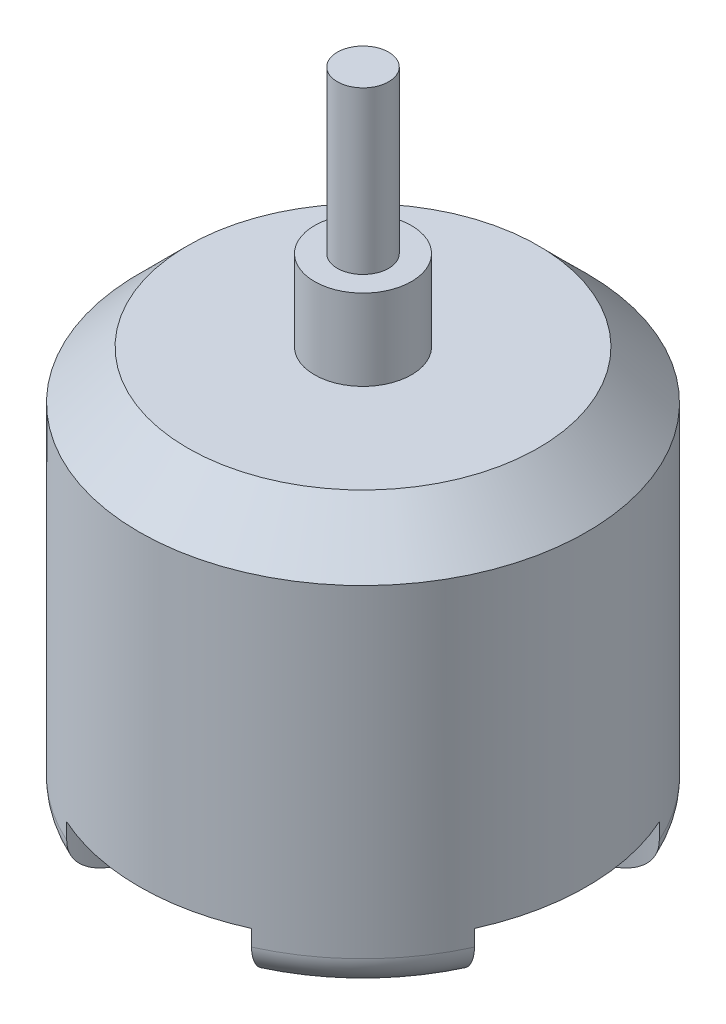
ISO-10303-21;
HEADER;
FILE_DESCRIPTION(('STEP AP214'),'2;1');
FILE_NAME('part.step','',(''),(''),'','','');
FILE_SCHEMA(('AUTOMOTIVE_DESIGN { 1 0 10303 214 1 1 1 1 }'));
ENDSEC;
DATA;
#1=APPLICATION_CONTEXT('core data for automotive mechanical design processes');
#2=APPLICATION_PROTOCOL_DEFINITION('international standard','automotive_design',2000,#1);
#3=PRODUCT_CONTEXT('',#1,'mechanical');
#4=PRODUCT('Part','Part','',(#3));
#5=PRODUCT_RELATED_PRODUCT_CATEGORY('part','',(#4));
#6=PRODUCT_DEFINITION_FORMATION('','',#4);
#7=PRODUCT_DEFINITION_CONTEXT('part definition',#1,'design');
#8=PRODUCT_DEFINITION('design','',#6,#7);
#9=PRODUCT_DEFINITION_SHAPE('','',#8);
#10=(LENGTH_UNIT() NAMED_UNIT(*) SI_UNIT(.MILLI.,.METRE.));
#11=(NAMED_UNIT(*) PLANE_ANGLE_UNIT() SI_UNIT($,.RADIAN.));
#12=(NAMED_UNIT(*) SI_UNIT($,.STERADIAN.) SOLID_ANGLE_UNIT());
#13=UNCERTAINTY_MEASURE_WITH_UNIT(LENGTH_MEASURE(1.E-05),#10,'distance_accuracy_value','');
#14=(GEOMETRIC_REPRESENTATION_CONTEXT(3) GLOBAL_UNCERTAINTY_ASSIGNED_CONTEXT((#13)) GLOBAL_UNIT_ASSIGNED_CONTEXT((#10,
#11,#12)) REPRESENTATION_CONTEXT('',''));
#15=CARTESIAN_POINT('',(0.,0.,0.));
#16=DIRECTION('',(0.,0.,1.));
#17=DIRECTION('',(1.,0.,0.));
#18=AXIS2_PLACEMENT_3D('',#15,#16,#17);
#19=CARTESIAN_POINT('',(0.,0.,0.));
#20=DIRECTION('',(0.,1.,0.));
#21=DIRECTION('',(0.,0.,1.));
#22=AXIS2_PLACEMENT_3D('',#19,#20,#21);
#23=PLANE('',#22);
#24=CARTESIAN_POINT('',(0.,0.,0.));
#25=DIRECTION('',(0.,1.,0.));
#26=DIRECTION('',(0.,0.,1.));
#27=AXIS2_PLACEMENT_3D('',#24,#25,#26);
#28=CIRCLE('',#27,13.85);
#29=CARTESIAN_POINT('',(-12.6145306859203,0.,-5.71805172886495));
#30=VERTEX_POINT('',#29);
#31=CARTESIAN_POINT('',(-12.6145306859206,0.,5.71805172886424));
#32=VERTEX_POINT('',#31);
#33=EDGE_CURVE('E274',#30,#32,#28,.T.);
#34=ORIENTED_EDGE('',*,*,#33,.F.);
#35=CARTESIAN_POINT('',(-13.8499999999996,0.,-3.92792607702686E-13));
#36=DIRECTION('',(0.,-1.,0.));
#37=DIRECTION('',(0.,0.,-1.));
#38=AXIS2_PLACEMENT_3D('',#35,#36,#37);
#39=CIRCLE('',#38,5.85000000000023);
#40=EDGE_CURVE('E191',#30,#32,#39,.T.);
#41=ORIENTED_EDGE('',*,*,#40,.T.);
#42=EDGE_LOOP('',(#34,#41));
#43=FACE_BOUND('',#42,.T.);
#44=ADVANCED_FACE('F43',(#43),#23,.F.);
#45=CARTESIAN_POINT('',(-5.71805172886431,0.,12.6145306859206));
#46=VERTEX_POINT('',#45);
#47=CARTESIAN_POINT('',(5.71805172886431,0.,12.6145306859206));
#48=VERTEX_POINT('',#47);
#49=EDGE_CURVE('E270',#46,#48,#28,.T.);
#50=ORIENTED_EDGE('',*,*,#49,.F.);
#51=CARTESIAN_POINT('',(0.,0.,13.85));
#52=DIRECTION('',(0.,-1.,0.));
#53=DIRECTION('',(0.,0.,-1.));
#54=AXIS2_PLACEMENT_3D('',#51,#52,#53);
#55=CIRCLE('',#54,5.85);
#56=EDGE_CURVE('E196',#46,#48,#55,.T.);
#57=ORIENTED_EDGE('',*,*,#56,.T.);
#58=EDGE_LOOP('',(#50,#57));
#59=FACE_BOUND('',#58,.T.);
#60=ADVANCED_FACE('F391',(#59),#23,.F.);
#61=CARTESIAN_POINT('',(12.6145306859206,0.,5.71805172886426));
#62=VERTEX_POINT('',#61);
#63=CARTESIAN_POINT('',(12.6145306859206,0.,-5.71805172886435));
#64=VERTEX_POINT('',#63);
#65=EDGE_CURVE('E275',#62,#64,#28,.T.);
#66=ORIENTED_EDGE('',*,*,#65,.F.);
#67=CARTESIAN_POINT('',(13.85,0.,0.));
#68=DIRECTION('',(0.,-1.,0.));
#69=DIRECTION('',(0.,0.,-1.));
#70=AXIS2_PLACEMENT_3D('',#67,#68,#69);
#71=CIRCLE('',#70,5.85);
#72=EDGE_CURVE('E216',#62,#64,#71,.T.);
#73=ORIENTED_EDGE('',*,*,#72,.T.);
#74=EDGE_LOOP('',(#66,#73));
#75=FACE_BOUND('',#74,.T.);
#76=ADVANCED_FACE('F397',(#75),#23,.F.);
#77=CARTESIAN_POINT('',(5.71805172886432,0.,-12.6145306859206));
#78=VERTEX_POINT('',#77);
#79=CARTESIAN_POINT('',(-5.71805172886432,0.,-12.6145306859206));
#80=VERTEX_POINT('',#79);
#81=EDGE_CURVE('E413',#78,#80,#28,.T.);
#82=ORIENTED_EDGE('',*,*,#81,.F.);
#83=CARTESIAN_POINT('',(0.,0.,-13.85));
#84=DIRECTION('',(0.,-1.,0.));
#85=DIRECTION('',(0.,0.,-1.));
#86=AXIS2_PLACEMENT_3D('',#83,#84,#85);
#87=CIRCLE('',#86,5.85000000000001);
#88=EDGE_CURVE('E212',#78,#80,#87,.T.);
#89=ORIENTED_EDGE('',*,*,#88,.T.);
#90=EDGE_LOOP('',(#82,#89));
#91=FACE_BOUND('',#90,.T.);
#92=ADVANCED_FACE('F393',(#91),#23,.F.);
#93=CARTESIAN_POINT('',(0.,0.,0.));
#94=DIRECTION('',(0.,1.,0.));
#95=DIRECTION('',(0.,0.,1.));
#96=AXIS2_PLACEMENT_3D('',#93,#94,#95);
#97=CYLINDRICAL_SURFACE('',#96,13.85);
#98=CARTESIAN_POINT('',(0.,19.,0.));
#99=DIRECTION('',(0.,1.,0.));
#100=DIRECTION('',(0.,0.,1.));
#101=AXIS2_PLACEMENT_3D('',#98,#99,#100);
#102=CIRCLE('',#101,13.85);
#103=CARTESIAN_POINT('',(0.,19.,13.85));
#104=VERTEX_POINT('',#103);
#105=EDGE_CURVE('E266',#104,#104,#102,.T.);
#106=ORIENTED_EDGE('',*,*,#105,.F.);
#107=EDGE_LOOP('',(#106));
#108=FACE_BOUND('',#107,.T.);
#109=DIRECTION('',(0.,1.,0.));
#110=VECTOR('',#109,1.);
#111=CARTESIAN_POINT('',(-5.71805172886432,-3.,-12.6145306859206));
#112=LINE('',#111,#110);
#113=CARTESIAN_POINT('',(-5.71805172886432,-1.,-12.6145306859206));
#114=VERTEX_POINT('',#113);
#115=EDGE_CURVE('E240',#114,#80,#112,.T.);
#116=ORIENTED_EDGE('',*,*,#115,.F.);
#117=CARTESIAN_POINT('',(0.,-1.,0.));
#118=DIRECTION('',(0.,-1.,0.));
#119=DIRECTION('',(0.,0.,-1.));
#120=AXIS2_PLACEMENT_3D('',#117,#118,#119);
#121=CIRCLE('',#120,13.85);
#122=CARTESIAN_POINT('',(-12.6145306859203,-1.,-5.71805172886495));
#123=VERTEX_POINT('',#122);
#124=EDGE_CURVE('E430',#114,#123,#121,.F.);
#125=ORIENTED_EDGE('',*,*,#124,.T.);
#126=DIRECTION('',(0.,1.,0.));
#127=VECTOR('',#126,1.);
#128=CARTESIAN_POINT('',(-12.6145306859203,-3.,-5.71805172886495));
#129=LINE('',#128,#127);
#130=EDGE_CURVE('E243',#123,#30,#129,.T.);
#131=ORIENTED_EDGE('',*,*,#130,.T.);
#132=ORIENTED_EDGE('',*,*,#33,.T.);
#133=DIRECTION('',(0.,1.,0.));
#134=VECTOR('',#133,1.);
#135=CARTESIAN_POINT('',(-12.6145306859206,-3.,5.71805172886424));
#136=LINE('',#135,#134);
#137=CARTESIAN_POINT('',(-12.6145306859206,-1.,5.71805172886424));
#138=VERTEX_POINT('',#137);
#139=EDGE_CURVE('E208',#138,#32,#136,.T.);
#140=ORIENTED_EDGE('',*,*,#139,.F.);
#141=CARTESIAN_POINT('',(0.,-1.,0.));
#142=DIRECTION('',(0.,-1.,0.));
#143=DIRECTION('',(0.,0.,-1.));
#144=AXIS2_PLACEMENT_3D('',#141,#142,#143);
#145=CIRCLE('',#144,13.85);
#146=CARTESIAN_POINT('',(-5.71805172886431,-1.,12.6145306859206));
#147=VERTEX_POINT('',#146);
#148=EDGE_CURVE('E65',#138,#147,#145,.F.);
#149=ORIENTED_EDGE('',*,*,#148,.T.);
#150=DIRECTION('',(0.,1.,0.));
#151=VECTOR('',#150,1.);
#152=CARTESIAN_POINT('',(-5.71805172886431,-3.,12.6145306859206));
#153=LINE('',#152,#151);
#154=EDGE_CURVE('E225',#147,#46,#153,.T.);
#155=ORIENTED_EDGE('',*,*,#154,.T.);
#156=ORIENTED_EDGE('',*,*,#49,.T.);
#157=DIRECTION('',(0.,1.,0.));
#158=VECTOR('',#157,1.);
#159=CARTESIAN_POINT('',(5.71805172886431,-3.,12.6145306859206));
#160=LINE('',#159,#158);
#161=CARTESIAN_POINT('',(5.71805172886431,-1.,12.6145306859206));
#162=VERTEX_POINT('',#161);
#163=EDGE_CURVE('E228',#162,#48,#160,.T.);
#164=ORIENTED_EDGE('',*,*,#163,.F.);
#165=CARTESIAN_POINT('',(0.,-1.,0.));
#166=DIRECTION('',(0.,-1.,0.));
#167=DIRECTION('',(0.,0.,-1.));
#168=AXIS2_PLACEMENT_3D('',#165,#166,#167);
#169=CIRCLE('',#168,13.85);
#170=CARTESIAN_POINT('',(12.6145306859206,-1.,5.71805172886426));
#171=VERTEX_POINT('',#170);
#172=EDGE_CURVE('E689',#162,#171,#169,.F.);
#173=ORIENTED_EDGE('',*,*,#172,.T.);
#174=DIRECTION('',(0.,1.,0.));
#175=VECTOR('',#174,1.);
#176=CARTESIAN_POINT('',(12.6145306859206,-3.,5.71805172886426));
#177=LINE('',#176,#175);
#178=EDGE_CURVE('E231',#171,#62,#177,.T.);
#179=ORIENTED_EDGE('',*,*,#178,.T.);
#180=ORIENTED_EDGE('',*,*,#65,.T.);
#181=DIRECTION('',(0.,1.,0.));
#182=VECTOR('',#181,1.);
#183=CARTESIAN_POINT('',(12.6145306859206,-3.,-5.71805172886435));
#184=LINE('',#183,#182);
#185=CARTESIAN_POINT('',(12.6145306859206,-1.,-5.71805172886435));
#186=VERTEX_POINT('',#185);
#187=EDGE_CURVE('E234',#186,#64,#184,.T.);
#188=ORIENTED_EDGE('',*,*,#187,.F.);
#189=CARTESIAN_POINT('',(0.,-1.,0.));
#190=DIRECTION('',(0.,-1.,0.));
#191=DIRECTION('',(0.,0.,-1.));
#192=AXIS2_PLACEMENT_3D('',#189,#190,#191);
#193=CIRCLE('',#192,13.85);
#194=CARTESIAN_POINT('',(5.71805172886432,-1.,-12.6145306859206));
#195=VERTEX_POINT('',#194);
#196=EDGE_CURVE('E695',#186,#195,#193,.F.);
#197=ORIENTED_EDGE('',*,*,#196,.T.);
#198=DIRECTION('',(0.,1.,0.));
#199=VECTOR('',#198,1.);
#200=CARTESIAN_POINT('',(5.71805172886432,-3.,-12.6145306859206));
#201=LINE('',#200,#199);
#202=EDGE_CURVE('E237',#195,#78,#201,.T.);
#203=ORIENTED_EDGE('',*,*,#202,.T.);
#204=ORIENTED_EDGE('',*,*,#81,.T.);
#205=EDGE_LOOP('',(#116,#125,#131,#132,#140,#149,#155,#156,#164,#173,#179,#180,#188,#197,#203,#204));
#206=FACE_BOUND('',#205,.T.);
#207=ADVANCED_FACE('F402',(#108,#206),#97,.T.);
#208=CARTESIAN_POINT('',(0.,19.,0.));
#209=DIRECTION('',(0.,-1.,0.));
#210=DIRECTION('',(0.,0.,-1.));
#211=AXIS2_PLACEMENT_3D('',#208,#209,#210);
#212=CONICAL_SURFACE('',#211,13.85,0.785398163397448);
#213=CARTESIAN_POINT('',(0.,22.,0.));
#214=DIRECTION('',(0.,1.,0.));
#215=DIRECTION('',(0.,0.,1.));
#216=AXIS2_PLACEMENT_3D('',#213,#214,#215);
#217=CIRCLE('',#216,10.85);
#218=CARTESIAN_POINT('',(0.,22.,10.85));
#219=VERTEX_POINT('',#218);
#220=EDGE_CURVE('E262',#219,#219,#217,.T.);
#221=ORIENTED_EDGE('',*,*,#220,.F.);
#222=EDGE_LOOP('',(#221));
#223=FACE_BOUND('',#222,.T.);
#224=ORIENTED_EDGE('',*,*,#105,.T.);
#225=EDGE_LOOP('',(#224));
#226=FACE_BOUND('',#225,.T.);
#227=ADVANCED_FACE('F408',(#223,#226),#212,.T.);
#228=CARTESIAN_POINT('',(3.,22.,0.));
#229=DIRECTION('',(0.,-1.,0.));
#230=DIRECTION('',(0.,0.,-1.));
#231=AXIS2_PLACEMENT_3D('',#228,#229,#230);
#232=PLANE('',#231);
#233=CARTESIAN_POINT('',(0.,22.,0.));
#234=DIRECTION('',(0.,1.,0.));
#235=DIRECTION('',(0.,0.,1.));
#236=AXIS2_PLACEMENT_3D('',#233,#234,#235);
#237=CIRCLE('',#236,3.);
#238=CARTESIAN_POINT('',(0.,22.,3.));
#239=VERTEX_POINT('',#238);
#240=EDGE_CURVE('E258',#239,#239,#237,.T.);
#241=ORIENTED_EDGE('',*,*,#240,.F.);
#242=EDGE_LOOP('',(#241));
#243=FACE_BOUND('',#242,.T.);
#244=ORIENTED_EDGE('',*,*,#220,.T.);
#245=EDGE_LOOP('',(#244));
#246=FACE_BOUND('',#245,.T.);
#247=ADVANCED_FACE('F463',(#243,#246),#232,.F.);
#248=CARTESIAN_POINT('',(0.,0.,0.));
#249=DIRECTION('',(0.,1.,0.));
#250=DIRECTION('',(0.,0.,1.));
#251=AXIS2_PLACEMENT_3D('',#248,#249,#250);
#252=CYLINDRICAL_SURFACE('',#251,3.);
#253=CARTESIAN_POINT('',(0.,27.,0.));
#254=DIRECTION('',(0.,1.,0.));
#255=DIRECTION('',(0.,0.,1.));
#256=AXIS2_PLACEMENT_3D('',#253,#254,#255);
#257=CIRCLE('',#256,3.);
#258=CARTESIAN_POINT('',(0.,27.,3.));
#259=VERTEX_POINT('',#258);
#260=EDGE_CURVE('E254',#259,#259,#257,.T.);
#261=ORIENTED_EDGE('',*,*,#260,.F.);
#262=EDGE_LOOP('',(#261));
#263=FACE_BOUND('',#262,.T.);
#264=ORIENTED_EDGE('',*,*,#240,.T.);
#265=EDGE_LOOP('',(#264));
#266=FACE_BOUND('',#265,.T.);
#267=ADVANCED_FACE('F459',(#263,#266),#252,.T.);
#268=CARTESIAN_POINT('',(3.,27.,0.));
#269=DIRECTION('',(0.,-1.,0.));
#270=DIRECTION('',(0.,0.,-1.));
#271=AXIS2_PLACEMENT_3D('',#268,#269,#270);
#272=PLANE('',#271);
#273=CARTESIAN_POINT('',(0.,27.,0.));
#274=DIRECTION('',(0.,1.,0.));
#275=DIRECTION('',(0.,0.,1.));
#276=AXIS2_PLACEMENT_3D('',#273,#274,#275);
#277=CIRCLE('',#276,1.58750000000001);
#278=CARTESIAN_POINT('',(0.,27.,1.58750000000001));
#279=VERTEX_POINT('',#278);
#280=EDGE_CURVE('E250',#279,#279,#277,.T.);
#281=ORIENTED_EDGE('',*,*,#280,.F.);
#282=EDGE_LOOP('',(#281));
#283=FACE_BOUND('',#282,.T.);
#284=ORIENTED_EDGE('',*,*,#260,.T.);
#285=EDGE_LOOP('',(#284));
#286=FACE_BOUND('',#285,.T.);
#287=ADVANCED_FACE('F455',(#283,#286),#272,.F.);
#288=CARTESIAN_POINT('',(0.,0.,0.));
#289=DIRECTION('',(0.,1.,0.));
#290=DIRECTION('',(0.,0.,1.));
#291=AXIS2_PLACEMENT_3D('',#288,#289,#290);
#292=CYLINDRICAL_SURFACE('',#291,1.5875);
#293=CARTESIAN_POINT('',(0.,37.,0.));
#294=DIRECTION('',(0.,1.,0.));
#295=DIRECTION('',(0.,0.,1.));
#296=AXIS2_PLACEMENT_3D('',#293,#294,#295);
#297=CIRCLE('',#296,1.5875);
#298=CARTESIAN_POINT('',(0.,37.,1.5875));
#299=VERTEX_POINT('',#298);
#300=EDGE_CURVE('E246',#299,#299,#297,.T.);
#301=ORIENTED_EDGE('',*,*,#300,.F.);
#302=EDGE_LOOP('',(#301));
#303=FACE_BOUND('',#302,.T.);
#304=ORIENTED_EDGE('',*,*,#280,.T.);
#305=EDGE_LOOP('',(#304));
#306=FACE_BOUND('',#305,.T.);
#307=ADVANCED_FACE('F451',(#303,#306),#292,.T.);
#308=CARTESIAN_POINT('',(1.5875,37.,0.));
#309=DIRECTION('',(0.,-1.,0.));
#310=DIRECTION('',(0.,0.,-1.));
#311=AXIS2_PLACEMENT_3D('',#308,#309,#310);
#312=PLANE('',#311);
#313=ORIENTED_EDGE('',*,*,#300,.T.);
#314=EDGE_LOOP('',(#313));
#315=FACE_BOUND('',#314,.T.);
#316=ADVANCED_FACE('F447',(#315),#312,.F.);
#317=CARTESIAN_POINT('',(-13.8499999999996,-3.,-3.92792607702686E-13));
#318=DIRECTION('',(0.,1.,0.));
#319=DIRECTION('',(0.,0.,1.));
#320=AXIS2_PLACEMENT_3D('',#317,#318,#319);
#321=CYLINDRICAL_SURFACE('',#320,5.85000000000023);
#322=ORIENTED_EDGE('',*,*,#130,.F.);
#323=CARTESIAN_POINT('',(-12.6145306859203,-1.,-5.71805172886495));
#324=CARTESIAN_POINT('',(-12.6145330000705,-1.05570081538762,-5.7180473894927));
#325=CARTESIAN_POINT('',(-12.6122020833294,-1.11137417006443,-5.71754911660652));
#326=CARTESIAN_POINT('',(-12.6029205618121,-1.22230756060143,-5.71553378080432));
#327=CARTESIAN_POINT('',(-12.5959706522789,-1.27756765739883,-5.71401687121143));
#328=CARTESIAN_POINT('',(-12.568310656893,-1.44192381325606,-5.70790246282174));
#329=CARTESIAN_POINT('',(-12.5407897579977,-1.54989578133468,-5.70174157621582));
#330=CARTESIAN_POINT('',(-12.4687472938042,-1.75954401260011,-5.68471569210493));
#331=CARTESIAN_POINT('',(-12.4242252171472,-1.86122008631306,-5.67385055310487));
#332=CARTESIAN_POINT('',(-12.3199343465871,-2.05566221921237,-5.64661795797403));
#333=CARTESIAN_POINT('',(-12.2601615774402,-2.14842594661591,-5.63024906688169));
#334=CARTESIAN_POINT('',(-12.126616817756,-2.32383660233649,-5.59082767388081));
#335=CARTESIAN_POINT('',(-12.0526561796309,-2.40631918240938,-5.56768259882573));
#336=CARTESIAN_POINT('',(-11.8939591577988,-2.55732989754863,-5.51392845667296));
#337=CARTESIAN_POINT('',(-11.8092227444341,-2.62585799420715,-5.48331936903208));
#338=CARTESIAN_POINT('',(-11.6322761712508,-2.7467464233644,-5.41416514264556));
#339=CARTESIAN_POINT('',(-11.5400922921115,-2.79916072023097,-5.37564722940965));
#340=CARTESIAN_POINT('',(-11.3512947749081,-2.88648116737863,-5.29052554737378));
#341=CARTESIAN_POINT('',(-11.2546843478148,-2.92139979606661,-5.24392757352402));
#342=CARTESIAN_POINT('',(-11.0908982633223,-2.96468414313223,-5.15902268272932));
#343=CARTESIAN_POINT('',(-11.0239551129778,-2.97793705152456,-5.12267287630856));
#344=CARTESIAN_POINT('',(-10.8907179187829,-2.99560323410721,-5.0468891484772));
#345=CARTESIAN_POINT('',(-10.8244234259063,-3.00002312818985,-5.00745755975316));
#346=CARTESIAN_POINT('',(-10.7589350180502,-3.,-4.96667064313437));
#347=B_SPLINE_CURVE_WITH_KNOTS('',3,(#323,#324,#325,#326,#327,#328,#329,#330,#331,#332,#333,
#334,#335,#336,#337,#338,#339,#340,#341,#342,#343,#344,#345,#346),.UNSPECIFIED.,.F.,.F.,(4,2,2,
2,2,2,2,2,2,2,2,4),(0.,0.166997380618441,0.333969630764376,0.667025697489288,1.00009178261168,
1.33324477355887,1.67118033576754,2.00911682808606,2.34590893848005,2.68246049602667,
2.91388037425278,3.14512674998118),.UNSPECIFIED.);
#348=CARTESIAN_POINT('',(-10.7589350180502,-3.,-4.96667064313437));
#349=VERTEX_POINT('',#348);
#350=EDGE_CURVE('E425',#123,#349,#347,.T.);
#351=ORIENTED_EDGE('',*,*,#350,.T.);
#352=CARTESIAN_POINT('',(-13.8499999999996,-3.,-3.92792607702686E-13));
#353=DIRECTION('',(0.,-1.,0.));
#354=DIRECTION('',(0.,0.,-1.));
#355=AXIS2_PLACEMENT_3D('',#352,#353,#354);
#356=CIRCLE('',#355,5.85000000000023);
#357=CARTESIAN_POINT('',(-10.7589350180505,-3.,4.96667064313376));
#358=VERTEX_POINT('',#357);
#359=EDGE_CURVE('E192',#349,#358,#356,.T.);
#360=ORIENTED_EDGE('',*,*,#359,.T.);
#361=CARTESIAN_POINT('',(-10.7589350180505,-3.,4.96667064313376));
#362=CARTESIAN_POINT('',(-10.804671377281,-3.00000722963411,4.99514322804048));
#363=CARTESIAN_POINT('',(-10.8508078080222,-2.99785662049402,5.02297231958333));
#364=CARTESIAN_POINT('',(-10.9435240861829,-2.98924656263651,5.07718036376893));
#365=CARTESIAN_POINT('',(-10.9901039042362,-2.98278739734946,5.10355941167656));
#366=CARTESIAN_POINT('',(-11.0832588392214,-2.96558506931647,5.15465452546555));
#367=CARTESIAN_POINT('',(-11.1298337622994,-2.95485089319194,5.17937395350071));
#368=CARTESIAN_POINT('',(-11.2226867152273,-2.92917097447299,5.22708859419441));
#369=CARTESIAN_POINT('',(-11.2689647516205,-2.91422532502858,5.25008384497433));
#370=CARTESIAN_POINT('',(-11.406832186466,-2.86318416830183,5.31636955143398));
#371=CARTESIAN_POINT('',(-11.4975002067876,-2.82087607758544,5.35698459878516));
#372=CARTESIAN_POINT('',(-11.673190662872,-2.72095543155455,5.4307565371459));
#373=CARTESIAN_POINT('',(-11.7582120307293,-2.66333999152948,5.46391202020346));
#374=CARTESIAN_POINT('',(-11.9210851915156,-2.53345115875329,5.52353312265023));
#375=CARTESIAN_POINT('',(-11.9988157373216,-2.46097813179598,5.54989523470648));
#376=CARTESIAN_POINT('',(-12.1431209412807,-2.30381384627048,5.5959643295655));
#377=CARTESIAN_POINT('',(-12.2096921616512,-2.21911883745185,5.61566926342497));
#378=CARTESIAN_POINT('',(-12.3313584015067,-2.03669846952929,5.64981090759676));
#379=CARTESIAN_POINT('',(-12.3860028606903,-1.9386356468541,5.66405257707542));
#380=CARTESIAN_POINT('',(-12.4787819352776,-1.73443314868439,5.68722729520342));
#381=CARTESIAN_POINT('',(-12.5169252042533,-1.62829774104613,5.69616312726397));
#382=CARTESIAN_POINT('',(-12.5686505890412,-1.43509123043783,5.70799478163376));
#383=CARTESIAN_POINT('',(-12.5858040685336,-1.34901363467935,5.71179072312809));
#384=CARTESIAN_POINT('',(-12.6087660618301,-1.17530572163119,5.71680591919321));
#385=CARTESIAN_POINT('',(-12.6145769475427,-1.08767573283887,5.71802571248007));
#386=CARTESIAN_POINT('',(-12.6145306859206,-1.,5.71805172886424));
#387=B_SPLINE_CURVE_WITH_KNOTS('',3,(#361,#362,#363,#364,#365,#366,#367,#368,#369,#370,#371,
#372,#373,#374,#375,#376,#377,#378,#379,#380,#381,#382,#383,#384,#385,#386),.UNSPECIFIED.,.F.,
.F.,(4,2,2,2,2,2,2,2,2,2,2,2,4),(0.,0.161574918589478,0.323139209320767,0.484365648828899,
0.64558852258622,0.96787955107993,1.2902313593075,1.61723760444341,1.94434440391874,
2.2822323198456,2.61994282479052,2.88274174984926,3.14548571377336),.UNSPECIFIED.);
#388=EDGE_CURVE('E73',#358,#138,#387,.T.);
#389=ORIENTED_EDGE('',*,*,#388,.T.);
#390=ORIENTED_EDGE('',*,*,#139,.T.);
#391=ORIENTED_EDGE('',*,*,#40,.F.);
#392=EDGE_LOOP('',(#322,#351,#360,#389,#390,#391));
#393=FACE_BOUND('',#392,.T.);
#394=ADVANCED_FACE('F423',(#393),#321,.F.);
#395=CARTESIAN_POINT('',(0.,-3.,-13.85));
#396=DIRECTION('',(0.,1.,0.));
#397=DIRECTION('',(0.,0.,1.));
#398=AXIS2_PLACEMENT_3D('',#395,#396,#397);
#399=CYLINDRICAL_SURFACE('',#398,5.85000000000001);
#400=CARTESIAN_POINT('',(0.,-3.,-13.85));
#401=DIRECTION('',(0.,-1.,0.));
#402=DIRECTION('',(0.,0.,-1.));
#403=AXIS2_PLACEMENT_3D('',#400,#401,#402);
#404=CIRCLE('',#403,5.85000000000001);
#405=CARTESIAN_POINT('',(4.96667064313367,-3.,-10.7589350180505));
#406=VERTEX_POINT('',#405);
#407=CARTESIAN_POINT('',(-4.96667064313367,-3.,-10.7589350180505));
#408=VERTEX_POINT('',#407);
#409=EDGE_CURVE('E195',#406,#408,#404,.T.);
#410=ORIENTED_EDGE('',*,*,#409,.T.);
#411=CARTESIAN_POINT('',(-4.96667064313367,-3.,-10.7589350180505));
#412=CARTESIAN_POINT('',(-4.9951432280404,-3.00000722963411,-10.804671377281));
#413=CARTESIAN_POINT('',(-5.02297231958326,-2.99785662049402,-10.8508078080223));
#414=CARTESIAN_POINT('',(-5.07718036376886,-2.98924656263651,-10.9435240861829));
#415=CARTESIAN_POINT('',(-5.1035594116765,-2.98278739734946,-10.9901039042362));
#416=CARTESIAN_POINT('',(-5.15465452546549,-2.96558506931647,-11.0832588392214));
#417=CARTESIAN_POINT('',(-5.17937395350066,-2.95485089319194,-11.1298337622994));
#418=CARTESIAN_POINT('',(-5.22708859419437,-2.929170974473,-11.2226867152273));
#419=CARTESIAN_POINT('',(-5.25008384497429,-2.91422532502858,-11.2689647516205));
#420=CARTESIAN_POINT('',(-5.31636955143395,-2.86318416830184,-11.406832186466));
#421=CARTESIAN_POINT('',(-5.35698459878514,-2.82087607758544,-11.4975002067876));
#422=CARTESIAN_POINT('',(-5.43075653714589,-2.72095543155455,-11.673190662872));
#423=CARTESIAN_POINT('',(-5.46391202020347,-2.66333999152949,-11.7582120307293));
#424=CARTESIAN_POINT('',(-5.52353312265025,-2.5334511587533,-11.9210851915156));
#425=CARTESIAN_POINT('',(-5.5498952347065,-2.46097813179599,-11.9988157373216));
#426=CARTESIAN_POINT('',(-5.59596432956553,-2.30381384627049,-12.1431209412807));
#427=CARTESIAN_POINT('',(-5.61566926342501,-2.21911883745186,-12.2096921616512));
#428=CARTESIAN_POINT('',(-5.64981090759681,-2.0366984695293,-12.3313584015067));
#429=CARTESIAN_POINT('',(-5.66405257707547,-1.93863564685411,-12.3860028606902));
#430=CARTESIAN_POINT('',(-5.68722729520349,-1.73443314868441,-12.4787819352775));
#431=CARTESIAN_POINT('',(-5.69616312726403,-1.62829774104615,-12.5169252042532));
#432=CARTESIAN_POINT('',(-5.70799478163384,-1.43509123043785,-12.5686505890411));
#433=CARTESIAN_POINT('',(-5.71179072312816,-1.34901363467937,-12.5858040685335));
#434=CARTESIAN_POINT('',(-5.71680591919328,-1.1753057216312,-12.60876606183));
#435=CARTESIAN_POINT('',(-5.71802571248015,-1.08767573283887,-12.6145769475427));
#436=CARTESIAN_POINT('',(-5.71805172886432,-1.,-12.6145306859206));
#437=B_SPLINE_CURVE_WITH_KNOTS('',3,(#411,#412,#413,#414,#415,#416,#417,#418,#419,#420,#421,
#422,#423,#424,#425,#426,#427,#428,#429,#430,#431,#432,#433,#434,#435,#436),.UNSPECIFIED.,.F.,
.F.,(4,2,2,2,2,2,2,2,2,2,2,2,4),(0.,0.16157491858948,0.323139209320766,0.484365648828896,
0.645588522586216,0.967879551079925,1.2902313593075,1.61723760444339,1.94434440391872,
2.28223231984558,2.61994282479049,2.88274174984924,3.14548571377336),.UNSPECIFIED.);
#438=EDGE_CURVE('E301',#408,#114,#437,.T.);
#439=ORIENTED_EDGE('',*,*,#438,.T.);
#440=ORIENTED_EDGE('',*,*,#115,.T.);
#441=ORIENTED_EDGE('',*,*,#88,.F.);
#442=ORIENTED_EDGE('',*,*,#202,.F.);
#443=CARTESIAN_POINT('',(5.71805172886432,-1.,-12.6145306859206));
#444=CARTESIAN_POINT('',(5.71804738949206,-1.05570081538762,-12.6145330000708));
#445=CARTESIAN_POINT('',(5.71754911660588,-1.11137417006444,-12.6122020833296));
#446=CARTESIAN_POINT('',(5.71553378080368,-1.22230756060144,-12.6029205618124));
#447=CARTESIAN_POINT('',(5.71401687121079,-1.27756765739884,-12.5959706522792));
#448=CARTESIAN_POINT('',(5.7079024628211,-1.44192381325606,-12.5683106568932));
#449=CARTESIAN_POINT('',(5.70174157621518,-1.54989578133469,-12.540789757998));
#450=CARTESIAN_POINT('',(5.68471569210429,-1.75954401260012,-12.4687472938045));
#451=CARTESIAN_POINT('',(5.67385055310423,-1.86122008631308,-12.4242252171475));
#452=CARTESIAN_POINT('',(5.64661795797339,-2.05566221921239,-12.3199343465874));
#453=CARTESIAN_POINT('',(5.63024906688104,-2.14842594661593,-12.2601615774404));
#454=CARTESIAN_POINT('',(5.59082767388015,-2.3238366023365,-12.1266168177563));
#455=CARTESIAN_POINT('',(5.56768259882507,-2.40631918240939,-12.0526561796312));
#456=CARTESIAN_POINT('',(5.51392845667229,-2.55732989754864,-11.8939591577991));
#457=CARTESIAN_POINT('',(5.48331936903142,-2.62585799420716,-11.8092227444344));
#458=CARTESIAN_POINT('',(5.41416514264489,-2.74674642336441,-11.6322761712511));
#459=CARTESIAN_POINT('',(5.37564722940897,-2.79916072023098,-11.5400922921118));
#460=CARTESIAN_POINT('',(5.2905255473731,-2.88648116737863,-11.3512947749084));
#461=CARTESIAN_POINT('',(5.24392757352334,-2.92139979606661,-11.2546843478151));
#462=CARTESIAN_POINT('',(5.15902268272863,-2.96468414313223,-11.0908982633226));
#463=CARTESIAN_POINT('',(5.12267287630788,-2.97793705152456,-11.0239551129781));
#464=CARTESIAN_POINT('',(5.04688914847651,-2.99560323410721,-10.8907179187833));
#465=CARTESIAN_POINT('',(5.00745755975246,-3.00002312818985,-10.8244234259066));
#466=CARTESIAN_POINT('',(4.96667064313367,-3.,-10.7589350180505));
#467=B_SPLINE_CURVE_WITH_KNOTS('',3,(#443,#444,#445,#446,#447,#448,#449,#450,#451,#452,#453,
#454,#455,#456,#457,#458,#459,#460,#461,#462,#463,#464,#465,#466),.UNSPECIFIED.,.F.,.F.,(4,2,2,
2,2,2,2,2,2,2,2,4),(0.,0.166997380618444,0.33396963076438,0.667025697489296,1.00009178261169,
1.33324477355889,1.67118033576755,2.00911682808608,2.34590893848006,2.68246049602667,
2.91388037425278,3.14512674998118),.UNSPECIFIED.);
#468=EDGE_CURVE('E292',#195,#406,#467,.T.);
#469=ORIENTED_EDGE('',*,*,#468,.T.);
#470=EDGE_LOOP('',(#410,#439,#440,#441,#442,#469));
#471=FACE_BOUND('',#470,.T.);
#472=ADVANCED_FACE('F308',(#471),#399,.F.);
#473=CARTESIAN_POINT('',(13.85,-3.,0.));
#474=DIRECTION('',(0.,1.,0.));
#475=DIRECTION('',(0.,0.,1.));
#476=AXIS2_PLACEMENT_3D('',#473,#474,#475);
#477=CYLINDRICAL_SURFACE('',#476,5.85);
#478=CARTESIAN_POINT('',(13.85,-3.,0.));
#479=DIRECTION('',(0.,-1.,0.));
#480=DIRECTION('',(0.,0.,-1.));
#481=AXIS2_PLACEMENT_3D('',#478,#479,#480);
#482=CIRCLE('',#481,5.85);
#483=CARTESIAN_POINT('',(10.7589350180506,-3.,4.96667064313363));
#484=VERTEX_POINT('',#483);
#485=CARTESIAN_POINT('',(10.7589350180505,-3.,-4.96667064313371));
#486=VERTEX_POINT('',#485);
#487=EDGE_CURVE('E200',#484,#486,#482,.T.);
#488=ORIENTED_EDGE('',*,*,#487,.T.);
#489=CARTESIAN_POINT('',(10.7589350180505,-3.,-4.96667064313371));
#490=CARTESIAN_POINT('',(10.804671377281,-3.00000722963411,-4.99514322804044));
#491=CARTESIAN_POINT('',(10.8508078080223,-2.99785662049402,-5.02297231958329));
#492=CARTESIAN_POINT('',(10.9435240861829,-2.98924656263651,-5.0771803637689));
#493=CARTESIAN_POINT('',(10.9901039042362,-2.98278739734946,-5.10355941167654));
#494=CARTESIAN_POINT('',(11.0832588392214,-2.96558506931647,-5.15465452546553));
#495=CARTESIAN_POINT('',(11.1298337622994,-2.95485089319194,-5.17937395350069));
#496=CARTESIAN_POINT('',(11.2226867152273,-2.929170974473,-5.22708859419441));
#497=CARTESIAN_POINT('',(11.2689647516205,-2.91422532502858,-5.25008384497433));
#498=CARTESIAN_POINT('',(11.406832186466,-2.86318416830183,-5.31636955143399));
#499=CARTESIAN_POINT('',(11.4975002067876,-2.82087607758544,-5.35698459878518));
#500=CARTESIAN_POINT('',(11.673190662872,-2.72095543155455,-5.43075653714593));
#501=CARTESIAN_POINT('',(11.7582120307292,-2.66333999152948,-5.46391202020351));
#502=CARTESIAN_POINT('',(11.9210851915156,-2.53345115875329,-5.52353312265029));
#503=CARTESIAN_POINT('',(11.9988157373216,-2.46097813179598,-5.54989523470654));
#504=CARTESIAN_POINT('',(12.1431209412806,-2.30381384627048,-5.59596432956557));
#505=CARTESIAN_POINT('',(12.2096921616512,-2.21911883745185,-5.61566926342505));
#506=CARTESIAN_POINT('',(12.3313584015066,-2.0366984695293,-5.64981090759685));
#507=CARTESIAN_POINT('',(12.3860028606902,-1.93863564685411,-5.66405257707551));
#508=CARTESIAN_POINT('',(12.4787819352775,-1.7344331486844,-5.68722729520353));
#509=CARTESIAN_POINT('',(12.5169252042532,-1.62829774104614,-5.69616312726407));
#510=CARTESIAN_POINT('',(12.5686505890411,-1.43509123043784,-5.70799478163387));
#511=CARTESIAN_POINT('',(12.5858040685335,-1.34901363467936,-5.7117907231282));
#512=CARTESIAN_POINT('',(12.60876606183,-1.1753057216312,-5.71680591919332));
#513=CARTESIAN_POINT('',(12.6145769475427,-1.08767573283887,-5.71802571248019));
#514=CARTESIAN_POINT('',(12.6145306859206,-1.,-5.71805172886436));
#515=B_SPLINE_CURVE_WITH_KNOTS('',3,(#489,#490,#491,#492,#493,#494,#495,#496,#497,#498,#499,
#500,#501,#502,#503,#504,#505,#506,#507,#508,#509,#510,#511,#512,#513,#514),.UNSPECIFIED.,.F.,
.F.,(4,2,2,2,2,2,2,2,2,2,2,2,4),(0.,0.16157491858948,0.323139209320768,0.484365648828899,
0.64558852258622,0.967879551079932,1.2902313593075,1.6172376044434,1.94434440391873,
2.28223231984558,2.6199428247905,2.88274174984925,3.14548571377336),.UNSPECIFIED.);
#516=EDGE_CURVE('E323',#486,#186,#515,.T.);
#517=ORIENTED_EDGE('',*,*,#516,.T.);
#518=ORIENTED_EDGE('',*,*,#187,.T.);
#519=ORIENTED_EDGE('',*,*,#72,.F.);
#520=ORIENTED_EDGE('',*,*,#178,.F.);
#521=CARTESIAN_POINT('',(12.6145306859206,-1.,5.71805172886426));
#522=CARTESIAN_POINT('',(12.6145330000708,-1.05570081538762,5.71804738949201));
#523=CARTESIAN_POINT('',(12.6122020833297,-1.11137417006444,5.71754911660583));
#524=CARTESIAN_POINT('',(12.6029205618124,-1.22230756060143,5.71553378080363));
#525=CARTESIAN_POINT('',(12.5959706522792,-1.27756765739883,5.71401687121074));
#526=CARTESIAN_POINT('',(12.5683106568933,-1.44192381325606,5.70790246282105));
#527=CARTESIAN_POINT('',(12.5407897579981,-1.54989578133469,5.70174157621513));
#528=CARTESIAN_POINT('',(12.4687472938046,-1.75954401260011,5.68471569210424));
#529=CARTESIAN_POINT('',(12.4242252171475,-1.86122008631307,5.67385055310418));
#530=CARTESIAN_POINT('',(12.3199343465875,-2.05566221921238,5.64661795797334));
#531=CARTESIAN_POINT('',(12.2601615774405,-2.14842594661592,5.630249066881));
#532=CARTESIAN_POINT('',(12.1266168177563,-2.3238366023365,5.59082767388011));
#533=CARTESIAN_POINT('',(12.0526561796312,-2.40631918240939,5.56768259882502));
#534=CARTESIAN_POINT('',(11.8939591577991,-2.55732989754864,5.51392845667225));
#535=CARTESIAN_POINT('',(11.8092227444344,-2.62585799420716,5.48331936903137));
#536=CARTESIAN_POINT('',(11.6322761712511,-2.74674642336441,5.41416514264485));
#537=CARTESIAN_POINT('',(11.5400922921118,-2.79916072023098,5.37564722940893));
#538=CARTESIAN_POINT('',(11.3512947749085,-2.88648116737863,5.29052554737306));
#539=CARTESIAN_POINT('',(11.2546843478152,-2.92139979606661,5.24392757352329));
#540=CARTESIAN_POINT('',(11.0908982633226,-2.96468414313223,5.15902268272859));
#541=CARTESIAN_POINT('',(11.0239551129781,-2.97793705152456,5.12267287630784));
#542=CARTESIAN_POINT('',(10.8907179187833,-2.99560323410721,5.04688914847647));
#543=CARTESIAN_POINT('',(10.8244234259066,-3.00002312818985,5.00745755975242));
#544=CARTESIAN_POINT('',(10.7589350180506,-3.,4.96667064313363));
#545=B_SPLINE_CURVE_WITH_KNOTS('',3,(#521,#522,#523,#524,#525,#526,#527,#528,#529,#530,#531,
#532,#533,#534,#535,#536,#537,#538,#539,#540,#541,#542,#543,#544),.UNSPECIFIED.,.F.,.F.,(4,2,2,
2,2,2,2,2,2,2,2,4),(0.,0.166997380618443,0.333969630764379,0.667025697489294,1.00009178261169,
1.33324477355888,1.67118033576755,2.00911682808607,2.34590893848006,2.68246049602667,
2.91388037425278,3.14512674998118),.UNSPECIFIED.);
#546=EDGE_CURVE('E330',#171,#484,#545,.T.);
#547=ORIENTED_EDGE('',*,*,#546,.T.);
#548=EDGE_LOOP('',(#488,#517,#518,#519,#520,#547));
#549=FACE_BOUND('',#548,.T.);
#550=ADVANCED_FACE('F340',(#549),#477,.F.);
#551=CARTESIAN_POINT('',(0.,-3.,13.85));
#552=DIRECTION('',(0.,1.,0.));
#553=DIRECTION('',(0.,0.,1.));
#554=AXIS2_PLACEMENT_3D('',#551,#552,#553);
#555=CYLINDRICAL_SURFACE('',#554,5.85);
#556=CARTESIAN_POINT('',(0.,-3.,13.85));
#557=DIRECTION('',(0.,-1.,0.));
#558=DIRECTION('',(0.,0.,-1.));
#559=AXIS2_PLACEMENT_3D('',#556,#557,#558);
#560=CIRCLE('',#559,5.85);
#561=CARTESIAN_POINT('',(-4.96667064313367,-3.,10.7589350180505));
#562=VERTEX_POINT('',#561);
#563=CARTESIAN_POINT('',(4.96667064313367,-3.,10.7589350180505));
#564=VERTEX_POINT('',#563);
#565=EDGE_CURVE('E204',#562,#564,#560,.T.);
#566=ORIENTED_EDGE('',*,*,#565,.T.);
#567=CARTESIAN_POINT('',(4.96667064313367,-3.,10.7589350180505));
#568=CARTESIAN_POINT('',(4.9951432280404,-3.00000722963411,10.804671377281));
#569=CARTESIAN_POINT('',(5.02297231958325,-2.99785662049402,10.8508078080223));
#570=CARTESIAN_POINT('',(5.07718036376886,-2.98924656263651,10.9435240861829));
#571=CARTESIAN_POINT('',(5.1035594116765,-2.98278739734946,10.9901039042362));
#572=CARTESIAN_POINT('',(5.15465452546549,-2.96558506931647,11.0832588392214));
#573=CARTESIAN_POINT('',(5.17937395350065,-2.95485089319194,11.1298337622994));
#574=CARTESIAN_POINT('',(5.22708859419437,-2.929170974473,11.2226867152273));
#575=CARTESIAN_POINT('',(5.25008384497429,-2.91422532502858,11.2689647516205));
#576=CARTESIAN_POINT('',(5.31636955143395,-2.86318416830183,11.406832186466));
#577=CARTESIAN_POINT('',(5.35698459878514,-2.82087607758544,11.4975002067876));
#578=CARTESIAN_POINT('',(5.43075653714589,-2.72095543155455,11.673190662872));
#579=CARTESIAN_POINT('',(5.46391202020346,-2.66333999152948,11.7582120307293));
#580=CARTESIAN_POINT('',(5.52353312265025,-2.53345115875329,11.9210851915156));
#581=CARTESIAN_POINT('',(5.5498952347065,-2.46097813179599,11.9988157373216));
#582=CARTESIAN_POINT('',(5.59596432956553,-2.30381384627048,12.1431209412807));
#583=CARTESIAN_POINT('',(5.61566926342501,-2.21911883745185,12.2096921616512));
#584=CARTESIAN_POINT('',(5.64981090759681,-2.0366984695293,12.3313584015067));
#585=CARTESIAN_POINT('',(5.66405257707547,-1.93863564685411,12.3860028606903));
#586=CARTESIAN_POINT('',(5.68722729520348,-1.7344331486844,12.4787819352775));
#587=CARTESIAN_POINT('',(5.69616312726403,-1.62829774104614,12.5169252042532));
#588=CARTESIAN_POINT('',(5.70799478163383,-1.43509123043784,12.5686505890411));
#589=CARTESIAN_POINT('',(5.71179072312816,-1.34901363467936,12.5858040685335));
#590=CARTESIAN_POINT('',(5.71680591919328,-1.1753057216312,12.60876606183));
#591=CARTESIAN_POINT('',(5.71802571248014,-1.08767573283887,12.6145769475427));
#592=CARTESIAN_POINT('',(5.71805172886431,-1.,12.6145306859206));
#593=B_SPLINE_CURVE_WITH_KNOTS('',3,(#567,#568,#569,#570,#571,#572,#573,#574,#575,#576,#577,
#578,#579,#580,#581,#582,#583,#584,#585,#586,#587,#588,#589,#590,#591,#592),.UNSPECIFIED.,.F.,
.F.,(4,2,2,2,2,2,2,2,2,2,2,2,4),(0.,0.16157491858948,0.323139209320769,0.484365648828898,
0.645588522586218,0.967879551079929,1.2902313593075,1.6172376044434,1.94434440391872,
2.28223231984558,2.6199428247905,2.88274174984925,3.14548571377336),.UNSPECIFIED.);
#594=EDGE_CURVE('E11',#564,#162,#593,.T.);
#595=ORIENTED_EDGE('',*,*,#594,.T.);
#596=ORIENTED_EDGE('',*,*,#163,.T.);
#597=ORIENTED_EDGE('',*,*,#56,.F.);
#598=ORIENTED_EDGE('',*,*,#154,.F.);
#599=CARTESIAN_POINT('',(-5.71805172886431,-1.,12.6145306859206));
#600=CARTESIAN_POINT('',(-5.71804738949205,-1.05570081538762,12.6145330000708));
#601=CARTESIAN_POINT('',(-5.71754911660587,-1.11137417006444,12.6122020833296));
#602=CARTESIAN_POINT('',(-5.71553378080368,-1.22230756060143,12.6029205618124));
#603=CARTESIAN_POINT('',(-5.71401687121078,-1.27756765739883,12.5959706522792));
#604=CARTESIAN_POINT('',(-5.70790246282109,-1.44192381325606,12.5683106568933));
#605=CARTESIAN_POINT('',(-5.70174157621518,-1.54989578133469,12.540789757998));
#606=CARTESIAN_POINT('',(-5.68471569210428,-1.75954401260012,12.4687472938045));
#607=CARTESIAN_POINT('',(-5.67385055310422,-1.86122008631307,12.4242252171475));
#608=CARTESIAN_POINT('',(-5.64661795797338,-2.05566221921239,12.3199343465874));
#609=CARTESIAN_POINT('',(-5.63024906688104,-2.14842594661593,12.2601615774404));
#610=CARTESIAN_POINT('',(-5.59082767388015,-2.3238366023365,12.1266168177563));
#611=CARTESIAN_POINT('',(-5.56768259882507,-2.40631918240939,12.0526561796312));
#612=CARTESIAN_POINT('',(-5.51392845667229,-2.55732989754864,11.8939591577991));
#613=CARTESIAN_POINT('',(-5.48331936903142,-2.62585799420716,11.8092227444344));
#614=CARTESIAN_POINT('',(-5.41416514264489,-2.74674642336441,11.6322761712511));
#615=CARTESIAN_POINT('',(-5.37564722940897,-2.79916072023098,11.5400922921118));
#616=CARTESIAN_POINT('',(-5.2905255473731,-2.88648116737863,11.3512947749084));
#617=CARTESIAN_POINT('',(-5.24392757352333,-2.92139979606661,11.2546843478152));
#618=CARTESIAN_POINT('',(-5.15902268272863,-2.96468414313223,11.0908982633226));
#619=CARTESIAN_POINT('',(-5.12267287630787,-2.97793705152456,11.0239551129781));
#620=CARTESIAN_POINT('',(-5.04688914847651,-2.99560323410721,10.8907179187833));
#621=CARTESIAN_POINT('',(-5.00745755975246,-3.00002312818985,10.8244234259066));
#622=CARTESIAN_POINT('',(-4.96667064313367,-3.,10.7589350180505));
#623=B_SPLINE_CURVE_WITH_KNOTS('',3,(#599,#600,#601,#602,#603,#604,#605,#606,#607,#608,#609,
#610,#611,#612,#613,#614,#615,#616,#617,#618,#619,#620,#621,#622),.UNSPECIFIED.,.F.,.F.,(4,2,2,
2,2,2,2,2,2,2,2,4),(0.,0.166997380618443,0.333969630764379,0.667025697489295,1.00009178261169,
1.33324477355889,1.67118033576755,2.00911682808607,2.34590893848006,2.68246049602667,
2.91388037425279,3.14512674998118),.UNSPECIFIED.);
#624=EDGE_CURVE('E58',#147,#562,#623,.T.);
#625=ORIENTED_EDGE('',*,*,#624,.T.);
#626=EDGE_LOOP('',(#566,#595,#596,#597,#598,#625));
#627=FACE_BOUND('',#626,.T.);
#628=ADVANCED_FACE('F343',(#627),#555,.F.);
#629=CARTESIAN_POINT('',(0.,-3.,0.));
#630=DIRECTION('',(0.,-1.,0.));
#631=DIRECTION('',(0.,0.,-1.));
#632=AXIS2_PLACEMENT_3D('',#629,#630,#631);
#633=PLANE('',#632);
#634=CARTESIAN_POINT('',(0.,-3.,0.));
#635=DIRECTION('',(0.,-1.,0.));
#636=DIRECTION('',(0.,0.,-1.));
#637=AXIS2_PLACEMENT_3D('',#634,#635,#636);
#638=CIRCLE('',#637,5.);
#639=CARTESIAN_POINT('',(0.,-3.,-5.));
#640=VERTEX_POINT('',#639);
#641=EDGE_CURVE('E718',#640,#640,#638,.T.);
#642=ORIENTED_EDGE('',*,*,#641,.F.);
#643=EDGE_LOOP('',(#642));
#644=FACE_BOUND('',#643,.T.);
#645=CARTESIAN_POINT('',(-5.65685424949238,-3.,5.65685424949238));
#646=DIRECTION('',(0.,-1.,0.));
#647=DIRECTION('',(0.,0.,-1.));
#648=AXIS2_PLACEMENT_3D('',#645,#646,#647);
#649=CIRCLE('',#648,1.69999999999999);
#650=CARTESIAN_POINT('',(-5.65685424949238,-3.,3.95685424949239));
#651=VERTEX_POINT('',#650);
#652=EDGE_CURVE('E160',#651,#651,#649,.T.);
#653=ORIENTED_EDGE('',*,*,#652,.F.);
#654=EDGE_LOOP('',(#653));
#655=FACE_BOUND('',#654,.T.);
#656=CARTESIAN_POINT('',(5.65685424949238,-3.,-5.65685424949238));
#657=DIRECTION('',(0.,-1.,0.));
#658=DIRECTION('',(0.,0.,-1.));
#659=AXIS2_PLACEMENT_3D('',#656,#657,#658);
#660=CIRCLE('',#659,1.69999999999999);
#661=CARTESIAN_POINT('',(5.65685424949238,-3.,-7.35685424949237));
#662=VERTEX_POINT('',#661);
#663=EDGE_CURVE('E159',#662,#662,#660,.T.);
#664=ORIENTED_EDGE('',*,*,#663,.F.);
#665=EDGE_LOOP('',(#664));
#666=FACE_BOUND('',#665,.T.);
#667=CARTESIAN_POINT('',(6.71751442127219,-3.,6.71751442127221));
#668=DIRECTION('',(0.,-1.,0.));
#669=DIRECTION('',(0.,0.,-1.));
#670=AXIS2_PLACEMENT_3D('',#667,#668,#669);
#671=CIRCLE('',#670,1.69999999999999);
#672=CARTESIAN_POINT('',(6.71751442127219,-3.,5.01751442127222));
#673=VERTEX_POINT('',#672);
#674=EDGE_CURVE('E175',#673,#673,#671,.T.);
#675=ORIENTED_EDGE('',*,*,#674,.F.);
#676=EDGE_LOOP('',(#675));
#677=FACE_BOUND('',#676,.T.);
#678=CARTESIAN_POINT('',(-6.71751442127219,-3.,-6.71751442127222));
#679=DIRECTION('',(0.,-1.,0.));
#680=DIRECTION('',(0.,0.,-1.));
#681=AXIS2_PLACEMENT_3D('',#678,#679,#680);
#682=CIRCLE('',#681,1.69999999999999);
#683=CARTESIAN_POINT('',(-6.71751442127219,-3.,-8.41751442127221));
#684=VERTEX_POINT('',#683);
#685=EDGE_CURVE('E183',#684,#684,#682,.T.);
#686=ORIENTED_EDGE('',*,*,#685,.F.);
#687=EDGE_LOOP('',(#686));
#688=FACE_BOUND('',#687,.T.);
#689=ORIENTED_EDGE('',*,*,#359,.F.);
#690=CARTESIAN_POINT('',(0.,-3.,0.));
#691=DIRECTION('',(0.,-1.,0.));
#692=DIRECTION('',(0.,0.,-1.));
#693=AXIS2_PLACEMENT_3D('',#690,#691,#692);
#694=CIRCLE('',#693,11.85);
#695=EDGE_CURVE('E288',#349,#408,#694,.T.);
#696=ORIENTED_EDGE('',*,*,#695,.T.);
#697=ORIENTED_EDGE('',*,*,#409,.F.);
#698=CARTESIAN_POINT('',(0.,-3.,0.));
#699=DIRECTION('',(0.,-1.,0.));
#700=DIRECTION('',(0.,0.,-1.));
#701=AXIS2_PLACEMENT_3D('',#698,#699,#700);
#702=CIRCLE('',#701,11.85);
#703=EDGE_CURVE('E284',#406,#486,#702,.T.);
#704=ORIENTED_EDGE('',*,*,#703,.T.);
#705=ORIENTED_EDGE('',*,*,#487,.F.);
#706=CARTESIAN_POINT('',(0.,-3.,0.));
#707=DIRECTION('',(0.,-1.,0.));
#708=DIRECTION('',(0.,0.,-1.));
#709=AXIS2_PLACEMENT_3D('',#706,#707,#708);
#710=CIRCLE('',#709,11.85);
#711=EDGE_CURVE('E280',#484,#564,#710,.T.);
#712=ORIENTED_EDGE('',*,*,#711,.T.);
#713=ORIENTED_EDGE('',*,*,#565,.F.);
#714=CARTESIAN_POINT('',(0.,-3.,0.));
#715=DIRECTION('',(0.,-1.,0.));
#716=DIRECTION('',(0.,0.,-1.));
#717=AXIS2_PLACEMENT_3D('',#714,#715,#716);
#718=CIRCLE('',#717,11.85);
#719=EDGE_CURVE('E276',#562,#358,#718,.T.);
#720=ORIENTED_EDGE('',*,*,#719,.T.);
#721=EDGE_LOOP('',(#689,#696,#697,#704,#705,#712,#713,#720));
#722=FACE_BOUND('',#721,.T.);
#723=ADVANCED_FACE('F349',(#644,#655,#666,#677,#688,#722),#633,.T.);
#724=CARTESIAN_POINT('',(0.,-1.,0.));
#725=DIRECTION('',(0.,-1.,0.));
#726=DIRECTION('',(0.,0.,-1.));
#727=AXIS2_PLACEMENT_3D('',#724,#725,#726);
#728=TOROIDAL_SURFACE('',#727,11.85,2.);
#729=ORIENTED_EDGE('',*,*,#350,.F.);
#730=ORIENTED_EDGE('',*,*,#124,.F.);
#731=ORIENTED_EDGE('',*,*,#438,.F.);
#732=ORIENTED_EDGE('',*,*,#695,.F.);
#733=EDGE_LOOP('',(#729,#730,#731,#732));
#734=FACE_BOUND('',#733,.T.);
#735=ADVANCED_FACE('F316',(#734),#728,.T.);
#736=CARTESIAN_POINT('',(0.,-1.,0.));
#737=DIRECTION('',(0.,-1.,0.));
#738=DIRECTION('',(0.,0.,-1.));
#739=AXIS2_PLACEMENT_3D('',#736,#737,#738);
#740=TOROIDAL_SURFACE('',#739,11.85,2.);
#741=ORIENTED_EDGE('',*,*,#468,.F.);
#742=ORIENTED_EDGE('',*,*,#196,.F.);
#743=ORIENTED_EDGE('',*,*,#516,.F.);
#744=ORIENTED_EDGE('',*,*,#703,.F.);
#745=EDGE_LOOP('',(#741,#742,#743,#744));
#746=FACE_BOUND('',#745,.T.);
#747=ADVANCED_FACE('F312',(#746),#740,.T.);
#748=CARTESIAN_POINT('',(0.,-1.,0.));
#749=DIRECTION('',(0.,-1.,0.));
#750=DIRECTION('',(0.,0.,-1.));
#751=AXIS2_PLACEMENT_3D('',#748,#749,#750);
#752=TOROIDAL_SURFACE('',#751,11.85,2.);
#753=ORIENTED_EDGE('',*,*,#546,.F.);
#754=ORIENTED_EDGE('',*,*,#172,.F.);
#755=ORIENTED_EDGE('',*,*,#594,.F.);
#756=ORIENTED_EDGE('',*,*,#711,.F.);
#757=EDGE_LOOP('',(#753,#754,#755,#756));
#758=FACE_BOUND('',#757,.T.);
#759=ADVANCED_FACE('F315',(#758),#752,.T.);
#760=CARTESIAN_POINT('',(0.,-1.,0.));
#761=DIRECTION('',(0.,-1.,0.));
#762=DIRECTION('',(0.,0.,-1.));
#763=AXIS2_PLACEMENT_3D('',#760,#761,#762);
#764=TOROIDAL_SURFACE('',#763,11.85,2.);
#765=ORIENTED_EDGE('',*,*,#624,.F.);
#766=ORIENTED_EDGE('',*,*,#148,.F.);
#767=ORIENTED_EDGE('',*,*,#388,.F.);
#768=ORIENTED_EDGE('',*,*,#719,.F.);
#769=EDGE_LOOP('',(#765,#766,#767,#768));
#770=FACE_BOUND('',#769,.T.);
#771=ADVANCED_FACE('F45',(#770),#764,.T.);
#772=CARTESIAN_POINT('',(-6.71751442127219,4.00000000000001,-6.71751442127222));
#773=DIRECTION('',(0.,-1.,0.));
#774=DIRECTION('',(0.,0.,-1.));
#775=AXIS2_PLACEMENT_3D('',#772,#773,#774);
#776=CONICAL_SURFACE('',#775,1.69999999999999,1.02974425867665);
#777=CARTESIAN_POINT('',(-6.71751442127219,5.02146305234686,-6.71751442127222));
#778=VERTEX_POINT('',#777);
#779=VERTEX_LOOP('',#778);
#780=FACE_BOUND('',#779,.T.);
#781=CARTESIAN_POINT('',(-6.71751442127219,4.00000000000001,-6.71751442127222));
#782=DIRECTION('',(0.,-1.,0.));
#783=DIRECTION('',(0.,0.,-1.));
#784=AXIS2_PLACEMENT_3D('',#781,#782,#783);
#785=CIRCLE('',#784,1.69999999999999);
#786=CARTESIAN_POINT('',(-6.71751442127219,4.00000000000001,-8.4175144212722));
#787=VERTEX_POINT('',#786);
#788=EDGE_CURVE('E187',#787,#787,#785,.T.);
#789=ORIENTED_EDGE('',*,*,#788,.T.);
#790=EDGE_LOOP('',(#789));
#791=FACE_BOUND('',#790,.T.);
#792=ADVANCED_FACE('F355',(#780,#791),#776,.F.);
#793=CARTESIAN_POINT('',(-6.71751442127219,-3.,-6.71751442127222));
#794=DIRECTION('',(0.,-1.,0.));
#795=DIRECTION('',(0.,0.,-1.));
#796=AXIS2_PLACEMENT_3D('',#793,#794,#795);
#797=CYLINDRICAL_SURFACE('',#796,1.69999999999999);
#798=ORIENTED_EDGE('',*,*,#788,.F.);
#799=EDGE_LOOP('',(#798));
#800=FACE_BOUND('',#799,.T.);
#801=ORIENTED_EDGE('',*,*,#685,.T.);
#802=EDGE_LOOP('',(#801));
#803=FACE_BOUND('',#802,.T.);
#804=ADVANCED_FACE('F358',(#800,#803),#797,.F.);
#805=CARTESIAN_POINT('',(6.71751442127219,4.00000000000001,6.71751442127221));
#806=DIRECTION('',(0.,-1.,0.));
#807=DIRECTION('',(0.,0.,-1.));
#808=AXIS2_PLACEMENT_3D('',#805,#806,#807);
#809=CONICAL_SURFACE('',#808,1.69999999999999,1.02974425867665);
#810=CARTESIAN_POINT('',(6.71751442127219,5.02146305234686,6.71751442127221));
#811=VERTEX_POINT('',#810);
#812=VERTEX_LOOP('',#811);
#813=FACE_BOUND('',#812,.T.);
#814=CARTESIAN_POINT('',(6.71751442127219,4.00000000000001,6.71751442127221));
#815=DIRECTION('',(0.,-1.,0.));
#816=DIRECTION('',(0.,0.,-1.));
#817=AXIS2_PLACEMENT_3D('',#814,#815,#816);
#818=CIRCLE('',#817,1.69999999999999);
#819=CARTESIAN_POINT('',(6.71751442127219,4.00000000000001,5.01751442127223));
#820=VERTEX_POINT('',#819);
#821=EDGE_CURVE('E179',#820,#820,#818,.T.);
#822=ORIENTED_EDGE('',*,*,#821,.T.);
#823=EDGE_LOOP('',(#822));
#824=FACE_BOUND('',#823,.T.);
#825=ADVANCED_FACE('F362',(#813,#824),#809,.F.);
#826=CARTESIAN_POINT('',(6.71751442127219,-3.,6.71751442127221));
#827=DIRECTION('',(0.,-1.,0.));
#828=DIRECTION('',(0.,0.,-1.));
#829=AXIS2_PLACEMENT_3D('',#826,#827,#828);
#830=CYLINDRICAL_SURFACE('',#829,1.69999999999999);
#831=ORIENTED_EDGE('',*,*,#821,.F.);
#832=EDGE_LOOP('',(#831));
#833=FACE_BOUND('',#832,.T.);
#834=ORIENTED_EDGE('',*,*,#674,.T.);
#835=EDGE_LOOP('',(#834));
#836=FACE_BOUND('',#835,.T.);
#837=ADVANCED_FACE('F366',(#833,#836),#830,.F.);
#838=CARTESIAN_POINT('',(5.65685424949238,4.00000000000001,-5.65685424949238));
#839=DIRECTION('',(0.,-1.,0.));
#840=DIRECTION('',(0.,0.,-1.));
#841=AXIS2_PLACEMENT_3D('',#838,#839,#840);
#842=CONICAL_SURFACE('',#841,1.69999999999999,1.02974425867665);
#843=CARTESIAN_POINT('',(5.65685424949238,5.02146305234686,-5.65685424949238));
#844=VERTEX_POINT('',#843);
#845=VERTEX_LOOP('',#844);
#846=FACE_BOUND('',#845,.T.);
#847=CARTESIAN_POINT('',(5.65685424949238,4.00000000000001,-5.65685424949238));
#848=DIRECTION('',(0.,-1.,0.));
#849=DIRECTION('',(0.,0.,-1.));
#850=AXIS2_PLACEMENT_3D('',#847,#848,#849);
#851=CIRCLE('',#850,1.69999999999999);
#852=CARTESIAN_POINT('',(5.65685424949238,4.00000000000001,-7.35685424949237));
#853=VERTEX_POINT('',#852);
#854=EDGE_CURVE('E165',#853,#853,#851,.T.);
#855=ORIENTED_EDGE('',*,*,#854,.T.);
#856=EDGE_LOOP('',(#855));
#857=FACE_BOUND('',#856,.T.);
#858=ADVANCED_FACE('F370',(#846,#857),#842,.F.);
#859=CARTESIAN_POINT('',(5.65685424949238,-3.,-5.65685424949238));
#860=DIRECTION('',(0.,-1.,0.));
#861=DIRECTION('',(0.,0.,-1.));
#862=AXIS2_PLACEMENT_3D('',#859,#860,#861);
#863=CYLINDRICAL_SURFACE('',#862,1.69999999999999);
#864=ORIENTED_EDGE('',*,*,#854,.F.);
#865=EDGE_LOOP('',(#864));
#866=FACE_BOUND('',#865,.T.);
#867=ORIENTED_EDGE('',*,*,#663,.T.);
#868=EDGE_LOOP('',(#867));
#869=FACE_BOUND('',#868,.T.);
#870=ADVANCED_FACE('F152',(#866,#869),#863,.F.);
#871=CARTESIAN_POINT('',(-5.65685424949238,4.00000000000001,5.65685424949238));
#872=DIRECTION('',(0.,-1.,0.));
#873=DIRECTION('',(0.,0.,-1.));
#874=AXIS2_PLACEMENT_3D('',#871,#872,#873);
#875=CONICAL_SURFACE('',#874,1.69999999999999,1.02974425867665);
#876=CARTESIAN_POINT('',(-5.65685424949238,5.02146305234686,5.65685424949238));
#877=VERTEX_POINT('',#876);
#878=VERTEX_LOOP('',#877);
#879=FACE_BOUND('',#878,.T.);
#880=CARTESIAN_POINT('',(-5.65685424949238,4.00000000000001,5.65685424949238));
#881=DIRECTION('',(0.,-1.,0.));
#882=DIRECTION('',(0.,0.,-1.));
#883=AXIS2_PLACEMENT_3D('',#880,#881,#882);
#884=CIRCLE('',#883,1.69999999999999);
#885=CARTESIAN_POINT('',(-5.65685424949238,4.00000000000001,3.95685424949239));
#886=VERTEX_POINT('',#885);
#887=EDGE_CURVE('E156',#886,#886,#884,.T.);
#888=ORIENTED_EDGE('',*,*,#887,.T.);
#889=EDGE_LOOP('',(#888));
#890=FACE_BOUND('',#889,.T.);
#891=ADVANCED_FACE('F148',(#879,#890),#875,.F.);
#892=CARTESIAN_POINT('',(-5.65685424949238,-3.,5.65685424949238));
#893=DIRECTION('',(0.,-1.,0.));
#894=DIRECTION('',(0.,0.,-1.));
#895=AXIS2_PLACEMENT_3D('',#892,#893,#894);
#896=CYLINDRICAL_SURFACE('',#895,1.69999999999999);
#897=ORIENTED_EDGE('',*,*,#887,.F.);
#898=EDGE_LOOP('',(#897));
#899=FACE_BOUND('',#898,.T.);
#900=ORIENTED_EDGE('',*,*,#652,.T.);
#901=EDGE_LOOP('',(#900));
#902=FACE_BOUND('',#901,.T.);
#903=ADVANCED_FACE('F151',(#899,#902),#896,.F.);
#904=CARTESIAN_POINT('',(0.,-4.,0.));
#905=DIRECTION('',(0.,1.,0.));
#906=DIRECTION('',(0.,0.,1.));
#907=AXIS2_PLACEMENT_3D('',#904,#905,#906);
#908=CYLINDRICAL_SURFACE('',#907,5.);
#909=CARTESIAN_POINT('',(0.,-4.,0.));
#910=DIRECTION('',(0.,-1.,0.));
#911=DIRECTION('',(0.,0.,-1.));
#912=AXIS2_PLACEMENT_3D('',#909,#910,#911);
#913=CIRCLE('',#912,5.);
#914=CARTESIAN_POINT('',(0.,-4.,-5.));
#915=VERTEX_POINT('',#914);
#916=EDGE_CURVE('E168',#915,#915,#913,.T.);
#917=ORIENTED_EDGE('',*,*,#916,.F.);
#918=EDGE_LOOP('',(#917));
#919=FACE_BOUND('',#918,.T.);
#920=ORIENTED_EDGE('',*,*,#641,.T.);
#921=EDGE_LOOP('',(#920));
#922=FACE_BOUND('',#921,.T.);
#923=ADVANCED_FACE('F380',(#919,#922),#908,.T.);
#924=CARTESIAN_POINT('',(0.,-4.,0.));
#925=DIRECTION('',(0.,-1.,0.));
#926=DIRECTION('',(0.,0.,-1.));
#927=AXIS2_PLACEMENT_3D('',#924,#925,#926);
#928=PLANE('',#927);
#929=ORIENTED_EDGE('',*,*,#916,.T.);
#930=EDGE_LOOP('',(#929));
#931=FACE_BOUND('',#930,.T.);
#932=ADVANCED_FACE('F383',(#931),#928,.T.);
#933=CLOSED_SHELL('',(#44,#60,#76,#92,#207,#227,#247,#267,#287,#307,#316,#394,#472,#550,#628,
#723,#735,#747,#759,#771,#792,#804,#825,#837,#858,#870,#891,#903,#923,#932));
#934=MANIFOLD_SOLID_BREP('B2',#933);
#935=ADVANCED_BREP_SHAPE_REPRESENTATION('',(#18,#934),#14);
#936=SHAPE_DEFINITION_REPRESENTATION(#9,#935);
ENDSEC;
END-ISO-10303-21;
